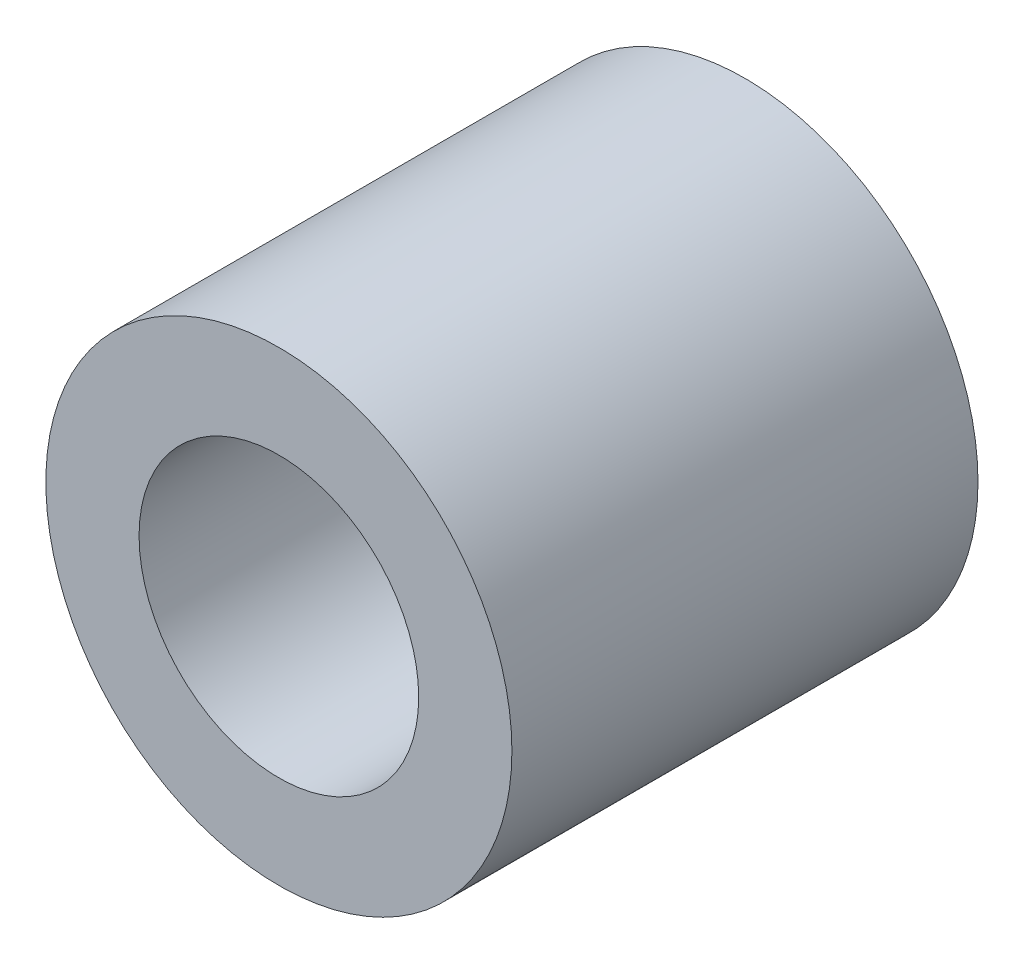
ISO-10303-21;
HEADER;
FILE_DESCRIPTION(('STEP AP214'),'2;1');
FILE_NAME('part.step','',(''),(''),'','','');
FILE_SCHEMA(('AUTOMOTIVE_DESIGN { 1 0 10303 214 1 1 1 1 }'));
ENDSEC;
DATA;
#1=APPLICATION_CONTEXT('core data for automotive mechanical design processes');
#2=APPLICATION_PROTOCOL_DEFINITION('international standard','automotive_design',2000,#1);
#3=PRODUCT_CONTEXT('',#1,'mechanical');
#4=PRODUCT('Part','Part','',(#3));
#5=PRODUCT_RELATED_PRODUCT_CATEGORY('part','',(#4));
#6=PRODUCT_DEFINITION_FORMATION('','',#4);
#7=PRODUCT_DEFINITION_CONTEXT('part definition',#1,'design');
#8=PRODUCT_DEFINITION('design','',#6,#7);
#9=PRODUCT_DEFINITION_SHAPE('','',#8);
#10=(LENGTH_UNIT() NAMED_UNIT(*) SI_UNIT(.MILLI.,.METRE.));
#11=(NAMED_UNIT(*) PLANE_ANGLE_UNIT() SI_UNIT($,.RADIAN.));
#12=(NAMED_UNIT(*) SI_UNIT($,.STERADIAN.) SOLID_ANGLE_UNIT());
#13=UNCERTAINTY_MEASURE_WITH_UNIT(LENGTH_MEASURE(1.E-05),#10,'distance_accuracy_value','');
#14=(GEOMETRIC_REPRESENTATION_CONTEXT(3) GLOBAL_UNCERTAINTY_ASSIGNED_CONTEXT((#13)) GLOBAL_UNIT_ASSIGNED_CONTEXT((#10,
#11,#12)) REPRESENTATION_CONTEXT('',''));
#15=CARTESIAN_POINT('',(0.,0.,0.));
#16=DIRECTION('',(0.,0.,1.));
#17=DIRECTION('',(1.,0.,0.));
#18=AXIS2_PLACEMENT_3D('',#15,#16,#17);
#19=CARTESIAN_POINT('',(0.,0.,10.));
#20=DIRECTION('',(0.,0.,-1.));
#21=DIRECTION('',(-1.,0.,0.));
#22=AXIS2_PLACEMENT_3D('',#19,#20,#21);
#23=CYLINDRICAL_SURFACE('',#22,5.);
#24=CARTESIAN_POINT('',(0.,0.,10.));
#25=DIRECTION('',(0.,0.,1.));
#26=DIRECTION('',(1.,0.,0.));
#27=AXIS2_PLACEMENT_3D('',#24,#25,#26);
#28=CIRCLE('',#27,5.);
#29=CARTESIAN_POINT('',(5.,0.,10.));
#30=VERTEX_POINT('',#29);
#31=EDGE_CURVE('E10',#30,#30,#28,.T.);
#32=ORIENTED_EDGE('',*,*,#31,.F.);
#33=EDGE_LOOP('',(#32));
#34=FACE_BOUND('',#33,.T.);
#35=CARTESIAN_POINT('',(0.,0.,0.));
#36=DIRECTION('',(0.,0.,1.));
#37=DIRECTION('',(1.,0.,0.));
#38=AXIS2_PLACEMENT_3D('',#35,#36,#37);
#39=CIRCLE('',#38,5.);
#40=CARTESIAN_POINT('',(5.,0.,0.));
#41=VERTEX_POINT('',#40);
#42=EDGE_CURVE('E34',#41,#41,#39,.T.);
#43=ORIENTED_EDGE('',*,*,#42,.T.);
#44=EDGE_LOOP('',(#43));
#45=FACE_BOUND('',#44,.T.);
#46=ADVANCED_FACE('F31',(#34,#45),#23,.T.);
#47=CARTESIAN_POINT('',(0.,0.,10.));
#48=DIRECTION('',(0.,0.,1.));
#49=DIRECTION('',(1.,0.,0.));
#50=AXIS2_PLACEMENT_3D('',#47,#48,#49);
#51=PLANE('',#50);
#52=CARTESIAN_POINT('',(0.,0.,10.));
#53=DIRECTION('',(0.,0.,-1.));
#54=DIRECTION('',(-1.,0.,0.));
#55=AXIS2_PLACEMENT_3D('',#52,#53,#54);
#56=CIRCLE('',#55,3.);
#57=CARTESIAN_POINT('',(-3.,0.,10.));
#58=VERTEX_POINT('',#57);
#59=EDGE_CURVE('E41',#58,#58,#56,.T.);
#60=ORIENTED_EDGE('',*,*,#59,.T.);
#61=EDGE_LOOP('',(#60));
#62=FACE_BOUND('',#61,.T.);
#63=ORIENTED_EDGE('',*,*,#31,.T.);
#64=EDGE_LOOP('',(#63));
#65=FACE_BOUND('',#64,.T.);
#66=ADVANCED_FACE('F49',(#62,#65),#51,.T.);
#67=CARTESIAN_POINT('',(0.,0.,0.));
#68=DIRECTION('',(0.,0.,1.));
#69=DIRECTION('',(1.,0.,0.));
#70=AXIS2_PLACEMENT_3D('',#67,#68,#69);
#71=PLANE('',#70);
#72=CARTESIAN_POINT('',(0.,0.,0.));
#73=DIRECTION('',(0.,0.,-1.));
#74=DIRECTION('',(-1.,0.,0.));
#75=AXIS2_PLACEMENT_3D('',#72,#73,#74);
#76=CIRCLE('',#75,3.);
#77=CARTESIAN_POINT('',(-3.,0.,0.));
#78=VERTEX_POINT('',#77);
#79=EDGE_CURVE('E43',#78,#78,#76,.T.);
#80=ORIENTED_EDGE('',*,*,#79,.F.);
#81=EDGE_LOOP('',(#80));
#82=FACE_BOUND('',#81,.T.);
#83=ORIENTED_EDGE('',*,*,#42,.F.);
#84=EDGE_LOOP('',(#83));
#85=FACE_BOUND('',#84,.T.);
#86=ADVANCED_FACE('F54',(#82,#85),#71,.F.);
#87=CARTESIAN_POINT('',(0.,0.,10.));
#88=DIRECTION('',(0.,0.,-1.));
#89=DIRECTION('',(-1.,0.,0.));
#90=AXIS2_PLACEMENT_3D('',#87,#88,#89);
#91=CYLINDRICAL_SURFACE('',#90,3.);
#92=ORIENTED_EDGE('',*,*,#59,.F.);
#93=EDGE_LOOP('',(#92));
#94=FACE_BOUND('',#93,.T.);
#95=ORIENTED_EDGE('',*,*,#79,.T.);
#96=EDGE_LOOP('',(#95));
#97=FACE_BOUND('',#96,.T.);
#98=ADVANCED_FACE('F51',(#94,#97),#91,.F.);
#99=CLOSED_SHELL('',(#46,#66,#86,#98));
#100=MANIFOLD_SOLID_BREP('B2',#99);
#101=ADVANCED_BREP_SHAPE_REPRESENTATION('',(#18,#100),#14);
#102=SHAPE_DEFINITION_REPRESENTATION(#9,#101);
ENDSEC;
END-ISO-10303-21;
